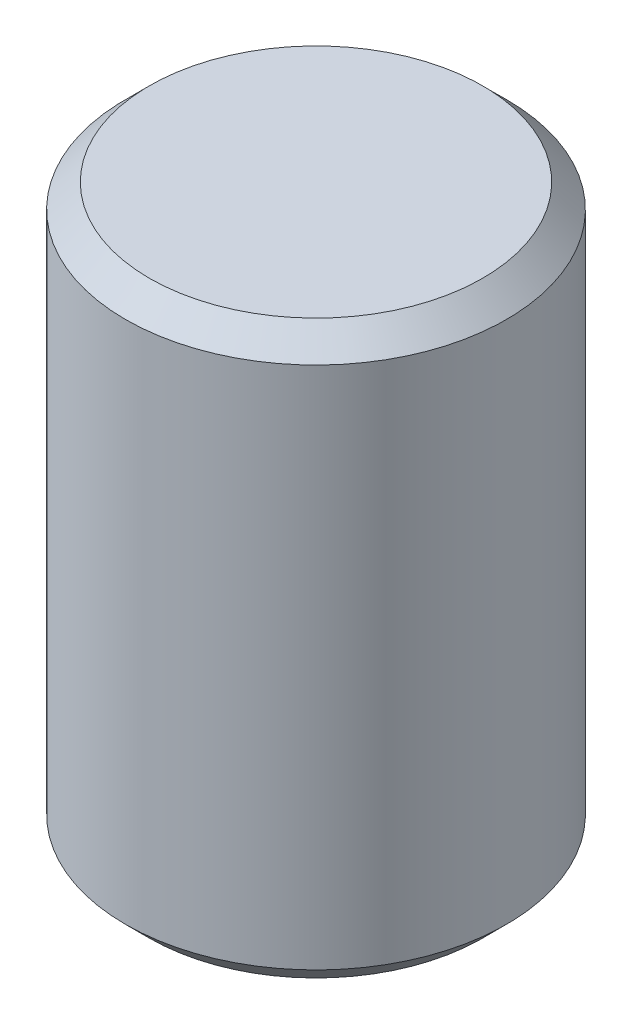
ISO-10303-21;
HEADER;
FILE_DESCRIPTION(('STEP AP214'),'2;1');
FILE_NAME('part.step','',(''),(''),'','','');
FILE_SCHEMA(('AUTOMOTIVE_DESIGN { 1 0 10303 214 1 1 1 1 }'));
ENDSEC;
DATA;
#1=APPLICATION_CONTEXT('core data for automotive mechanical design processes');
#2=APPLICATION_PROTOCOL_DEFINITION('international standard','automotive_design',2000,#1);
#3=PRODUCT_CONTEXT('',#1,'mechanical');
#4=PRODUCT('Part','Part','',(#3));
#5=PRODUCT_RELATED_PRODUCT_CATEGORY('part','',(#4));
#6=PRODUCT_DEFINITION_FORMATION('','',#4);
#7=PRODUCT_DEFINITION_CONTEXT('part definition',#1,'design');
#8=PRODUCT_DEFINITION('design','',#6,#7);
#9=PRODUCT_DEFINITION_SHAPE('','',#8);
#10=(LENGTH_UNIT() NAMED_UNIT(*) SI_UNIT(.MILLI.,.METRE.));
#11=(NAMED_UNIT(*) PLANE_ANGLE_UNIT() SI_UNIT($,.RADIAN.));
#12=(NAMED_UNIT(*) SI_UNIT($,.STERADIAN.) SOLID_ANGLE_UNIT());
#13=UNCERTAINTY_MEASURE_WITH_UNIT(LENGTH_MEASURE(1.E-05),#10,'distance_accuracy_value','');
#14=(GEOMETRIC_REPRESENTATION_CONTEXT(3) GLOBAL_UNCERTAINTY_ASSIGNED_CONTEXT((#13)) GLOBAL_UNIT_ASSIGNED_CONTEXT((#10,
#11,#12)) REPRESENTATION_CONTEXT('',''));
#15=CARTESIAN_POINT('',(0.,0.,0.));
#16=DIRECTION('',(0.,0.,1.));
#17=DIRECTION('',(1.,0.,0.));
#18=AXIS2_PLACEMENT_3D('',#15,#16,#17);
#19=CARTESIAN_POINT('',(0.,6.,0.));
#20=DIRECTION('',(0.,-1.,0.));
#21=DIRECTION('',(0.,0.,-1.));
#22=AXIS2_PLACEMENT_3D('',#19,#20,#21);
#23=CYLINDRICAL_SURFACE('',#22,4.);
#24=CARTESIAN_POINT('',(0.,-5.5,0.));
#25=DIRECTION('',(0.,1.,0.));
#26=DIRECTION('',(0.,0.,1.));
#27=AXIS2_PLACEMENT_3D('',#24,#25,#26);
#28=CIRCLE('',#27,4.);
#29=CARTESIAN_POINT('',(0.,-5.5,4.));
#30=VERTEX_POINT('',#29);
#31=EDGE_CURVE('E49',#30,#30,#28,.T.);
#32=ORIENTED_EDGE('',*,*,#31,.T.);
#33=EDGE_LOOP('',(#32));
#34=FACE_BOUND('',#33,.T.);
#35=CARTESIAN_POINT('',(0.,5.5,0.));
#36=DIRECTION('',(0.,1.,0.));
#37=DIRECTION('',(0.,0.,1.));
#38=AXIS2_PLACEMENT_3D('',#35,#36,#37);
#39=CIRCLE('',#38,4.);
#40=CARTESIAN_POINT('',(0.,5.5,4.));
#41=VERTEX_POINT('',#40);
#42=EDGE_CURVE('E53',#41,#41,#39,.F.);
#43=ORIENTED_EDGE('',*,*,#42,.T.);
#44=EDGE_LOOP('',(#43));
#45=FACE_BOUND('',#44,.T.);
#46=ADVANCED_FACE('F37',(#34,#45),#23,.T.);
#47=CARTESIAN_POINT('',(0.,6.,0.));
#48=DIRECTION('',(0.,1.,0.));
#49=DIRECTION('',(0.,0.,1.));
#50=AXIS2_PLACEMENT_3D('',#47,#48,#49);
#51=PLANE('',#50);
#52=CARTESIAN_POINT('',(0.,6.,0.));
#53=DIRECTION('',(0.,1.,0.));
#54=DIRECTION('',(0.,0.,1.));
#55=AXIS2_PLACEMENT_3D('',#52,#53,#54);
#56=CIRCLE('',#55,3.5);
#57=CARTESIAN_POINT('',(0.,6.,3.5));
#58=VERTEX_POINT('',#57);
#59=EDGE_CURVE('E10',#58,#58,#56,.T.);
#60=ORIENTED_EDGE('',*,*,#59,.T.);
#61=EDGE_LOOP('',(#60));
#62=FACE_BOUND('',#61,.T.);
#63=ADVANCED_FACE('F69',(#62),#51,.T.);
#64=CARTESIAN_POINT('',(0.,-6.,0.));
#65=DIRECTION('',(0.,1.,0.));
#66=DIRECTION('',(0.,0.,1.));
#67=AXIS2_PLACEMENT_3D('',#64,#65,#66);
#68=PLANE('',#67);
#69=CARTESIAN_POINT('',(0.,-6.,0.));
#70=DIRECTION('',(0.,1.,0.));
#71=DIRECTION('',(0.,0.,1.));
#72=AXIS2_PLACEMENT_3D('',#69,#70,#71);
#73=CIRCLE('',#72,3.5);
#74=CARTESIAN_POINT('',(0.,-6.,3.5));
#75=VERTEX_POINT('',#74);
#76=EDGE_CURVE('E45',#75,#75,#73,.F.);
#77=ORIENTED_EDGE('',*,*,#76,.T.);
#78=EDGE_LOOP('',(#77));
#79=FACE_BOUND('',#78,.T.);
#80=ADVANCED_FACE('F66',(#79),#68,.F.);
#81=CARTESIAN_POINT('',(0.,-5.5,0.));
#82=DIRECTION('',(0.,1.,0.));
#83=DIRECTION('',(0.,0.,1.));
#84=AXIS2_PLACEMENT_3D('',#81,#82,#83);
#85=CONICAL_SURFACE('',#84,4.,0.785398163397451);
#86=ORIENTED_EDGE('',*,*,#76,.F.);
#87=EDGE_LOOP('',(#86));
#88=FACE_BOUND('',#87,.T.);
#89=ORIENTED_EDGE('',*,*,#31,.F.);
#90=EDGE_LOOP('',(#89));
#91=FACE_BOUND('',#90,.T.);
#92=ADVANCED_FACE('F62',(#88,#91),#85,.T.);
#93=CARTESIAN_POINT('',(0.,6.,0.));
#94=DIRECTION('',(0.,-1.,0.));
#95=DIRECTION('',(0.,0.,-1.));
#96=AXIS2_PLACEMENT_3D('',#93,#94,#95);
#97=CONICAL_SURFACE('',#96,3.5,0.785398163397445);
#98=ORIENTED_EDGE('',*,*,#42,.F.);
#99=EDGE_LOOP('',(#98));
#100=FACE_BOUND('',#99,.T.);
#101=ORIENTED_EDGE('',*,*,#59,.F.);
#102=EDGE_LOOP('',(#101));
#103=FACE_BOUND('',#102,.T.);
#104=ADVANCED_FACE('F40',(#100,#103),#97,.T.);
#105=CLOSED_SHELL('',(#46,#63,#80,#92,#104));
#106=MANIFOLD_SOLID_BREP('B2',#105);
#107=ADVANCED_BREP_SHAPE_REPRESENTATION('',(#18,#106),#14);
#108=SHAPE_DEFINITION_REPRESENTATION(#9,#107);
ENDSEC;
END-ISO-10303-21;
